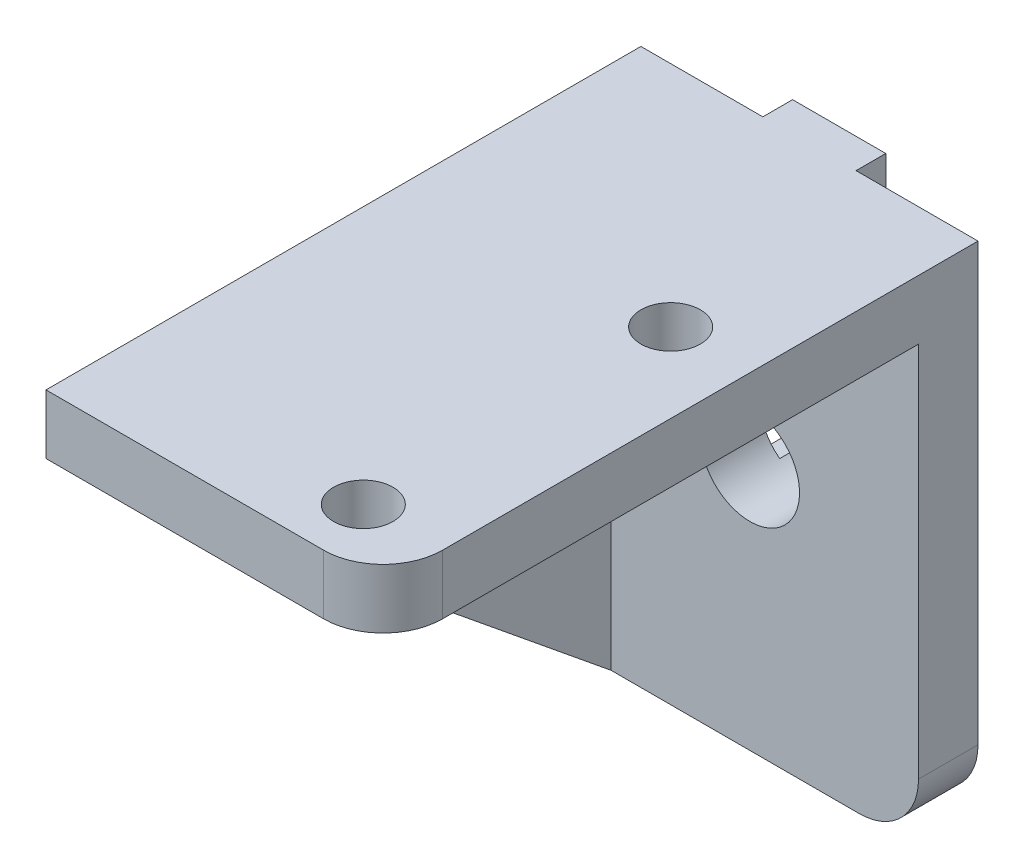
ISO-10303-21;
HEADER;
FILE_DESCRIPTION(('STEP AP214'),'2;1');
FILE_NAME('part.step','',(''),(''),'','','');
FILE_SCHEMA(('AUTOMOTIVE_DESIGN { 1 0 10303 214 1 1 1 1 }'));
ENDSEC;
DATA;
#1=APPLICATION_CONTEXT('core data for automotive mechanical design processes');
#2=APPLICATION_PROTOCOL_DEFINITION('international standard','automotive_design',2000,#1);
#3=PRODUCT_CONTEXT('',#1,'mechanical');
#4=PRODUCT('Part','Part','',(#3));
#5=PRODUCT_RELATED_PRODUCT_CATEGORY('part','',(#4));
#6=PRODUCT_DEFINITION_FORMATION('','',#4);
#7=PRODUCT_DEFINITION_CONTEXT('part definition',#1,'design');
#8=PRODUCT_DEFINITION('design','',#6,#7);
#9=PRODUCT_DEFINITION_SHAPE('','',#8);
#10=(LENGTH_UNIT() NAMED_UNIT(*) SI_UNIT(.MILLI.,.METRE.));
#11=(NAMED_UNIT(*) PLANE_ANGLE_UNIT() SI_UNIT($,.RADIAN.));
#12=(NAMED_UNIT(*) SI_UNIT($,.STERADIAN.) SOLID_ANGLE_UNIT());
#13=UNCERTAINTY_MEASURE_WITH_UNIT(LENGTH_MEASURE(1.E-05),#10,'distance_accuracy_value','');
#14=(GEOMETRIC_REPRESENTATION_CONTEXT(3) GLOBAL_UNCERTAINTY_ASSIGNED_CONTEXT((#13)) GLOBAL_UNIT_ASSIGNED_CONTEXT((#10,
#11,#12)) REPRESENTATION_CONTEXT('',''));
#15=CARTESIAN_POINT('',(0.,0.,0.));
#16=DIRECTION('',(0.,0.,1.));
#17=DIRECTION('',(1.,0.,0.));
#18=AXIS2_PLACEMENT_3D('',#15,#16,#17);
#19=CARTESIAN_POINT('',(-2.35,12.5,-1.5));
#20=DIRECTION('',(1.,0.,0.));
#21=DIRECTION('',(0.,0.,-1.));
#22=AXIS2_PLACEMENT_3D('',#19,#20,#21);
#23=PLANE('',#22);
#24=DIRECTION('',(0.,-1.,0.));
#25=VECTOR('',#24,1.);
#26=CARTESIAN_POINT('',(-2.35,12.5,-1.5));
#27=LINE('',#26,#25);
#28=CARTESIAN_POINT('',(-2.35,12.5,-1.5));
#29=VERTEX_POINT('',#28);
#30=CARTESIAN_POINT('',(-2.35,2.,-1.5));
#31=VERTEX_POINT('',#30);
#32=EDGE_CURVE('E334',#29,#31,#27,.T.);
#33=ORIENTED_EDGE('',*,*,#32,.T.);
#34=DIRECTION('',(0.,0.,-1.));
#35=VECTOR('',#34,1.);
#36=CARTESIAN_POINT('',(-2.35,2.,-1.5));
#37=LINE('',#36,#35);
#38=CARTESIAN_POINT('',(-2.35,2.,0.));
#39=VERTEX_POINT('',#38);
#40=EDGE_CURVE('E270',#39,#31,#37,.T.);
#41=ORIENTED_EDGE('',*,*,#40,.F.);
#42=DIRECTION('',(0.,-1.,0.));
#43=VECTOR('',#42,1.);
#44=CARTESIAN_POINT('',(-2.35,12.5,0.));
#45=LINE('',#44,#43);
#46=CARTESIAN_POINT('',(-2.35,12.5,0.));
#47=VERTEX_POINT('',#46);
#48=EDGE_CURVE('E211',#47,#39,#45,.T.);
#49=ORIENTED_EDGE('',*,*,#48,.F.);
#50=DIRECTION('',(0.,0.,1.));
#51=VECTOR('',#50,1.);
#52=CARTESIAN_POINT('',(-2.35,12.5,-1.5));
#53=LINE('',#52,#51);
#54=EDGE_CURVE('E303',#29,#47,#53,.T.);
#55=ORIENTED_EDGE('',*,*,#54,.F.);
#56=EDGE_LOOP('',(#33,#41,#49,#55));
#57=FACE_BOUND('',#56,.T.);
#58=ADVANCED_FACE('F34',(#57),#23,.F.);
#59=CARTESIAN_POINT('',(2.35,12.5,-1.5));
#60=DIRECTION('',(-1.,0.,0.));
#61=DIRECTION('',(0.,0.,1.));
#62=AXIS2_PLACEMENT_3D('',#59,#60,#61);
#63=PLANE('',#62);
#64=DIRECTION('',(0.,-1.,0.));
#65=VECTOR('',#64,1.);
#66=CARTESIAN_POINT('',(2.35,12.5,-1.5));
#67=LINE('',#66,#65);
#68=CARTESIAN_POINT('',(2.35,-2.,-1.5));
#69=VERTEX_POINT('',#68);
#70=CARTESIAN_POINT('',(2.35,-12.5,-1.5));
#71=VERTEX_POINT('',#70);
#72=EDGE_CURVE('E337',#69,#71,#67,.T.);
#73=ORIENTED_EDGE('',*,*,#72,.F.);
#74=DIRECTION('',(0.,0.,1.));
#75=VECTOR('',#74,1.);
#76=CARTESIAN_POINT('',(2.35,-2.,-1.5));
#77=LINE('',#76,#75);
#78=CARTESIAN_POINT('',(2.35,-2.,0.));
#79=VERTEX_POINT('',#78);
#80=EDGE_CURVE('E286',#69,#79,#77,.T.);
#81=ORIENTED_EDGE('',*,*,#80,.T.);
#82=DIRECTION('',(0.,-1.,0.));
#83=VECTOR('',#82,1.);
#84=CARTESIAN_POINT('',(2.35,12.5,0.));
#85=LINE('',#84,#83);
#86=CARTESIAN_POINT('',(2.35,-12.5,0.));
#87=VERTEX_POINT('',#86);
#88=EDGE_CURVE('E341',#79,#87,#85,.T.);
#89=ORIENTED_EDGE('',*,*,#88,.T.);
#90=DIRECTION('',(0.,0.,-1.));
#91=VECTOR('',#90,1.);
#92=CARTESIAN_POINT('',(2.35,-12.5,-1.5));
#93=LINE('',#92,#91);
#94=EDGE_CURVE('E329',#87,#71,#93,.T.);
#95=ORIENTED_EDGE('',*,*,#94,.T.);
#96=EDGE_LOOP('',(#73,#81,#89,#95));
#97=FACE_BOUND('',#96,.T.);
#98=ADVANCED_FACE('F365',(#97),#63,.F.);
#99=CARTESIAN_POINT('',(-2.35,12.5,-1.5));
#100=DIRECTION('',(0.,0.,1.));
#101=DIRECTION('',(1.,0.,0.));
#102=AXIS2_PLACEMENT_3D('',#99,#100,#101);
#103=PLANE('',#102);
#104=CARTESIAN_POINT('',(2.35,12.5,-1.5));
#105=VERTEX_POINT('',#104);
#106=CARTESIAN_POINT('',(2.35,2.,-1.5));
#107=VERTEX_POINT('',#106);
#108=EDGE_CURVE('E338',#105,#107,#67,.T.);
#109=ORIENTED_EDGE('',*,*,#108,.T.);
#110=DIRECTION('',(-1.,0.,0.));
#111=VECTOR('',#110,1.);
#112=CARTESIAN_POINT('',(8.5,2.,-1.5));
#113=LINE('',#112,#111);
#114=CARTESIAN_POINT('',(1.5,2.,-1.5));
#115=VERTEX_POINT('',#114);
#116=EDGE_CURVE('E276',#107,#115,#113,.T.);
#117=ORIENTED_EDGE('',*,*,#116,.T.);
#118=CARTESIAN_POINT('',(0.,0.,-1.5));
#119=DIRECTION('',(0.,0.,1.));
#120=DIRECTION('',(1.,0.,0.));
#121=AXIS2_PLACEMENT_3D('',#118,#119,#120);
#122=CIRCLE('',#121,2.5);
#123=CARTESIAN_POINT('',(-1.5,2.,-1.5));
#124=VERTEX_POINT('',#123);
#125=EDGE_CURVE('E292',#115,#124,#122,.T.);
#126=ORIENTED_EDGE('',*,*,#125,.T.);
#127=EDGE_CURVE('E273',#124,#31,#113,.T.);
#128=ORIENTED_EDGE('',*,*,#127,.T.);
#129=ORIENTED_EDGE('',*,*,#32,.F.);
#130=DIRECTION('',(-1.,0.,0.));
#131=VECTOR('',#130,1.);
#132=CARTESIAN_POINT('',(-2.35,12.5,-1.5));
#133=LINE('',#132,#131);
#134=EDGE_CURVE('E315',#105,#29,#133,.T.);
#135=ORIENTED_EDGE('',*,*,#134,.F.);
#136=EDGE_LOOP('',(#109,#117,#126,#128,#129,#135));
#137=FACE_BOUND('',#136,.T.);
#138=ADVANCED_FACE('F429',(#137),#103,.F.);
#139=CARTESIAN_POINT('',(-2.35,-2.,0.));
#140=VERTEX_POINT('',#139);
#141=CARTESIAN_POINT('',(-2.35,-12.5,0.));
#142=VERTEX_POINT('',#141);
#143=EDGE_CURVE('E204',#140,#142,#45,.T.);
#144=ORIENTED_EDGE('',*,*,#143,.F.);
#145=DIRECTION('',(0.,0.,1.));
#146=VECTOR('',#145,1.);
#147=CARTESIAN_POINT('',(-2.35,-2.,-1.5));
#148=LINE('',#147,#146);
#149=CARTESIAN_POINT('',(-2.35,-2.,-1.5));
#150=VERTEX_POINT('',#149);
#151=EDGE_CURVE('E267',#150,#140,#148,.T.);
#152=ORIENTED_EDGE('',*,*,#151,.F.);
#153=CARTESIAN_POINT('',(-2.35,-12.5,-1.5));
#154=VERTEX_POINT('',#153);
#155=EDGE_CURVE('E317',#150,#154,#27,.T.);
#156=ORIENTED_EDGE('',*,*,#155,.T.);
#157=DIRECTION('',(0.,0.,1.));
#158=VECTOR('',#157,1.);
#159=CARTESIAN_POINT('',(-2.35,-12.5,-1.5));
#160=LINE('',#159,#158);
#161=EDGE_CURVE('E302',#154,#142,#160,.T.);
#162=ORIENTED_EDGE('',*,*,#161,.T.);
#163=EDGE_LOOP('',(#144,#152,#156,#162));
#164=FACE_BOUND('',#163,.T.);
#165=ADVANCED_FACE('F386',(#164),#23,.F.);
#166=CARTESIAN_POINT('',(-8.5,12.5,0.));
#167=DIRECTION('',(0.,0.,1.));
#168=DIRECTION('',(1.,0.,0.));
#169=AXIS2_PLACEMENT_3D('',#166,#167,#168);
#170=PLANE('',#169);
#171=DIRECTION('',(-1.,0.,0.));
#172=VECTOR('',#171,1.);
#173=CARTESIAN_POINT('',(-8.5,-12.5,0.));
#174=LINE('',#173,#172);
#175=CARTESIAN_POINT('',(-8.5,-12.5,0.));
#176=VERTEX_POINT('',#175);
#177=EDGE_CURVE('E320',#142,#176,#174,.T.);
#178=ORIENTED_EDGE('',*,*,#177,.T.);
#179=DIRECTION('',(0.,-1.,0.));
#180=VECTOR('',#179,1.);
#181=CARTESIAN_POINT('',(-8.5,12.5,0.));
#182=LINE('',#181,#180);
#183=CARTESIAN_POINT('',(-8.5,12.5,0.));
#184=VERTEX_POINT('',#183);
#185=EDGE_CURVE('E201',#184,#176,#182,.T.);
#186=ORIENTED_EDGE('',*,*,#185,.F.);
#187=DIRECTION('',(-1.,0.,0.));
#188=VECTOR('',#187,1.);
#189=CARTESIAN_POINT('',(-8.5,12.5,0.));
#190=LINE('',#189,#188);
#191=EDGE_CURVE('E306',#47,#184,#190,.T.);
#192=ORIENTED_EDGE('',*,*,#191,.F.);
#193=ORIENTED_EDGE('',*,*,#48,.T.);
#194=DIRECTION('',(-1.,0.,0.));
#195=VECTOR('',#194,1.);
#196=CARTESIAN_POINT('',(8.5,2.,0.));
#197=LINE('',#196,#195);
#198=CARTESIAN_POINT('',(-1.5,2.,0.));
#199=VERTEX_POINT('',#198);
#200=EDGE_CURVE('E278',#199,#39,#197,.T.);
#201=ORIENTED_EDGE('',*,*,#200,.F.);
#202=CARTESIAN_POINT('',(0.,0.,0.));
#203=DIRECTION('',(0.,0.,1.));
#204=DIRECTION('',(1.,0.,0.));
#205=AXIS2_PLACEMENT_3D('',#202,#203,#204);
#206=CIRCLE('',#205,2.5);
#207=CARTESIAN_POINT('',(-1.5,-2.,0.));
#208=VERTEX_POINT('',#207);
#209=EDGE_CURVE('E300',#199,#208,#206,.T.);
#210=ORIENTED_EDGE('',*,*,#209,.T.);
#211=DIRECTION('',(-1.,0.,0.));
#212=VECTOR('',#211,1.);
#213=CARTESIAN_POINT('',(8.5,-2.,0.));
#214=LINE('',#213,#212);
#215=EDGE_CURVE('E282',#208,#140,#214,.T.);
#216=ORIENTED_EDGE('',*,*,#215,.T.);
#217=ORIENTED_EDGE('',*,*,#143,.T.);
#218=EDGE_LOOP('',(#178,#186,#192,#193,#201,#210,#216,#217));
#219=FACE_BOUND('',#218,.T.);
#220=ADVANCED_FACE('F389',(#219),#170,.F.);
#221=CARTESIAN_POINT('',(-8.5,12.5,0.));
#222=DIRECTION('',(1.,0.,0.));
#223=DIRECTION('',(0.,0.,-1.));
#224=AXIS2_PLACEMENT_3D('',#221,#222,#223);
#225=PLANE('',#224);
#226=DIRECTION('',(0.,0.,1.));
#227=VECTOR('',#226,1.);
#228=CARTESIAN_POINT('',(-8.5,-12.5,0.));
#229=LINE('',#228,#227);
#230=CARTESIAN_POINT('',(-8.5,-12.5,3.));
#231=VERTEX_POINT('',#230);
#232=EDGE_CURVE('E196',#176,#231,#229,.T.);
#233=ORIENTED_EDGE('',*,*,#232,.T.);
#234=DIRECTION('',(0.,0.631672951162236,0.775234985517289));
#235=VECTOR('',#234,1.);
#236=CARTESIAN_POINT('',(-8.5,9.5,30.));
#237=LINE('',#236,#235);
#238=CARTESIAN_POINT('',(-8.5,9.5,30.));
#239=VERTEX_POINT('',#238);
#240=EDGE_CURVE('E179',#231,#239,#237,.T.);
#241=ORIENTED_EDGE('',*,*,#240,.T.);
#242=DIRECTION('',(0.,-1.,0.));
#243=VECTOR('',#242,1.);
#244=CARTESIAN_POINT('',(-8.5,12.5,30.));
#245=LINE('',#244,#243);
#246=CARTESIAN_POINT('',(-8.5,12.5,30.));
#247=VERTEX_POINT('',#246);
#248=EDGE_CURVE('E193',#247,#239,#245,.T.);
#249=ORIENTED_EDGE('',*,*,#248,.F.);
#250=DIRECTION('',(0.,0.,1.));
#251=VECTOR('',#250,1.);
#252=CARTESIAN_POINT('',(-8.5,12.5,0.));
#253=LINE('',#252,#251);
#254=EDGE_CURVE('E309',#184,#247,#253,.T.);
#255=ORIENTED_EDGE('',*,*,#254,.F.);
#256=ORIENTED_EDGE('',*,*,#185,.T.);
#257=EDGE_LOOP('',(#233,#241,#249,#255,#256));
#258=FACE_BOUND('',#257,.T.);
#259=ADVANCED_FACE('F191',(#258),#225,.F.);
#260=CARTESIAN_POINT('',(-7.,12.5,30.));
#261=DIRECTION('',(0.,0.,-1.));
#262=DIRECTION('',(-1.,0.,0.));
#263=AXIS2_PLACEMENT_3D('',#260,#261,#262);
#264=PLANE('',#263);
#265=DIRECTION('',(1.,0.,0.));
#266=VECTOR('',#265,1.);
#267=CARTESIAN_POINT('',(8.5,9.5,30.));
#268=LINE('',#267,#266);
#269=CARTESIAN_POINT('',(-6.99999999999999,9.5,30.));
#270=VERTEX_POINT('',#269);
#271=CARTESIAN_POINT('',(5.5,9.5,30.));
#272=VERTEX_POINT('',#271);
#273=EDGE_CURVE('E254',#270,#272,#268,.T.);
#274=ORIENTED_EDGE('',*,*,#273,.T.);
#275=DIRECTION('',(0.,1.,0.));
#276=VECTOR('',#275,1.);
#277=CARTESIAN_POINT('',(5.5,12.5,30.));
#278=LINE('',#277,#276);
#279=CARTESIAN_POINT('',(5.5,12.5,30.));
#280=VERTEX_POINT('',#279);
#281=EDGE_CURVE('E239',#272,#280,#278,.T.);
#282=ORIENTED_EDGE('',*,*,#281,.T.);
#283=DIRECTION('',(1.,0.,0.));
#284=VECTOR('',#283,1.);
#285=CARTESIAN_POINT('',(-7.,12.5,30.));
#286=LINE('',#285,#284);
#287=EDGE_CURVE('E200',#247,#280,#286,.T.);
#288=ORIENTED_EDGE('',*,*,#287,.F.);
#289=ORIENTED_EDGE('',*,*,#248,.T.);
#290=DIRECTION('',(1.,0.,0.));
#291=VECTOR('',#290,1.);
#292=CARTESIAN_POINT('',(-8.5,9.5,30.));
#293=LINE('',#292,#291);
#294=EDGE_CURVE('E176',#239,#270,#293,.T.);
#295=ORIENTED_EDGE('',*,*,#294,.T.);
#296=EDGE_LOOP('',(#274,#282,#288,#289,#295));
#297=FACE_BOUND('',#296,.T.);
#298=ADVANCED_FACE('F198',(#297),#264,.F.);
#299=CARTESIAN_POINT('',(-7.,12.5,3.));
#300=DIRECTION('',(-1.,0.,0.));
#301=DIRECTION('',(0.,0.,1.));
#302=AXIS2_PLACEMENT_3D('',#299,#300,#301);
#303=PLANE('',#302);
#304=DIRECTION('',(0.,0.,1.));
#305=VECTOR('',#304,1.);
#306=CARTESIAN_POINT('',(-7.,9.5,3.));
#307=LINE('',#306,#305);
#308=CARTESIAN_POINT('',(-7.,9.5,3.));
#309=VERTEX_POINT('',#308);
#310=EDGE_CURVE('E260',#309,#270,#307,.T.);
#311=ORIENTED_EDGE('',*,*,#310,.T.);
#312=DIRECTION('',(0.,0.631672951162236,0.775234985517289));
#313=VECTOR('',#312,1.);
#314=CARTESIAN_POINT('',(-6.99999999999999,9.5,30.));
#315=LINE('',#314,#313);
#316=CARTESIAN_POINT('',(-7.,-12.5,3.));
#317=VERTEX_POINT('',#316);
#318=EDGE_CURVE('E182',#317,#270,#315,.T.);
#319=ORIENTED_EDGE('',*,*,#318,.F.);
#320=DIRECTION('',(0.,-1.,0.));
#321=VECTOR('',#320,1.);
#322=CARTESIAN_POINT('',(-7.,12.5,3.));
#323=LINE('',#322,#321);
#324=EDGE_CURVE('E202',#309,#317,#323,.T.);
#325=ORIENTED_EDGE('',*,*,#324,.F.);
#326=EDGE_LOOP('',(#311,#319,#325));
#327=FACE_BOUND('',#326,.T.);
#328=ADVANCED_FACE('F458',(#327),#303,.F.);
#329=CARTESIAN_POINT('',(8.5,12.5,3.));
#330=DIRECTION('',(0.,0.,-1.));
#331=DIRECTION('',(-1.,0.,0.));
#332=AXIS2_PLACEMENT_3D('',#329,#330,#331);
#333=PLANE('',#332);
#334=CARTESIAN_POINT('',(0.,0.,3.));
#335=DIRECTION('',(0.,0.,-1.));
#336=DIRECTION('',(-1.,0.,0.));
#337=AXIS2_PLACEMENT_3D('',#334,#335,#336);
#338=CIRCLE('',#337,2.5);
#339=CARTESIAN_POINT('',(-2.5,0.,3.));
#340=VERTEX_POINT('',#339);
#341=EDGE_CURVE('E297',#340,#340,#338,.T.);
#342=ORIENTED_EDGE('',*,*,#341,.T.);
#343=EDGE_LOOP('',(#342));
#344=FACE_BOUND('',#343,.T.);
#345=DIRECTION('',(1.,0.,0.));
#346=VECTOR('',#345,1.);
#347=CARTESIAN_POINT('',(8.5,-12.5,3.));
#348=LINE('',#347,#346);
#349=CARTESIAN_POINT('',(5.5,-12.5,3.));
#350=VERTEX_POINT('',#349);
#351=EDGE_CURVE('E324',#317,#350,#348,.T.);
#352=ORIENTED_EDGE('',*,*,#351,.T.);
#353=CARTESIAN_POINT('',(5.5,-9.5,3.));
#354=DIRECTION('',(0.,0.,-1.));
#355=DIRECTION('',(-1.,0.,0.));
#356=AXIS2_PLACEMENT_3D('',#353,#354,#355);
#357=CIRCLE('',#356,3.);
#358=CARTESIAN_POINT('',(8.5,-9.5,3.));
#359=VERTEX_POINT('',#358);
#360=EDGE_CURVE('E237',#350,#359,#357,.F.);
#361=ORIENTED_EDGE('',*,*,#360,.T.);
#362=DIRECTION('',(0.,-1.,0.));
#363=VECTOR('',#362,1.);
#364=CARTESIAN_POINT('',(8.5,12.5,3.));
#365=LINE('',#364,#363);
#366=CARTESIAN_POINT('',(8.5,9.5,3.));
#367=VERTEX_POINT('',#366);
#368=EDGE_CURVE('E207',#367,#359,#365,.T.);
#369=ORIENTED_EDGE('',*,*,#368,.F.);
#370=DIRECTION('',(-1.,0.,0.));
#371=VECTOR('',#370,1.);
#372=CARTESIAN_POINT('',(8.5,9.5,3.));
#373=LINE('',#372,#371);
#374=EDGE_CURVE('E256',#367,#309,#373,.T.);
#375=ORIENTED_EDGE('',*,*,#374,.T.);
#376=ORIENTED_EDGE('',*,*,#324,.T.);
#377=EDGE_LOOP('',(#352,#361,#369,#375,#376));
#378=FACE_BOUND('',#377,.T.);
#379=ADVANCED_FACE('F455',(#344,#378),#333,.F.);
#380=CARTESIAN_POINT('',(8.5,12.5,3.));
#381=DIRECTION('',(-1.,0.,0.));
#382=DIRECTION('',(0.,0.,1.));
#383=AXIS2_PLACEMENT_3D('',#380,#381,#382);
#384=PLANE('',#383);
#385=ORIENTED_EDGE('',*,*,#368,.T.);
#386=DIRECTION('',(0.,0.,-1.));
#387=VECTOR('',#386,1.);
#388=CARTESIAN_POINT('',(8.5,-9.5,3.));
#389=LINE('',#388,#387);
#390=CARTESIAN_POINT('',(8.5,-9.5,0.));
#391=VERTEX_POINT('',#390);
#392=EDGE_CURVE('E230',#359,#391,#389,.T.);
#393=ORIENTED_EDGE('',*,*,#392,.T.);
#394=DIRECTION('',(0.,-1.,0.));
#395=VECTOR('',#394,1.);
#396=CARTESIAN_POINT('',(8.5,12.5,0.));
#397=LINE('',#396,#395);
#398=CARTESIAN_POINT('',(8.5,12.5,0.));
#399=VERTEX_POINT('',#398);
#400=EDGE_CURVE('E250',#399,#391,#397,.T.);
#401=ORIENTED_EDGE('',*,*,#400,.F.);
#402=DIRECTION('',(0.,0.,-1.));
#403=VECTOR('',#402,1.);
#404=CARTESIAN_POINT('',(8.5,12.5,3.));
#405=LINE('',#404,#403);
#406=CARTESIAN_POINT('',(8.5,12.5,27.));
#407=VERTEX_POINT('',#406);
#408=EDGE_CURVE('E244',#407,#399,#405,.T.);
#409=ORIENTED_EDGE('',*,*,#408,.F.);
#410=DIRECTION('',(0.,1.,0.));
#411=VECTOR('',#410,1.);
#412=CARTESIAN_POINT('',(8.5,12.5,27.));
#413=LINE('',#412,#411);
#414=CARTESIAN_POINT('',(8.5,9.5,27.));
#415=VERTEX_POINT('',#414);
#416=EDGE_CURVE('E228',#407,#415,#413,.F.);
#417=ORIENTED_EDGE('',*,*,#416,.T.);
#418=DIRECTION('',(0.,0.,-1.));
#419=VECTOR('',#418,1.);
#420=CARTESIAN_POINT('',(8.5,9.5,0.));
#421=LINE('',#420,#419);
#422=EDGE_CURVE('E257',#415,#367,#421,.T.);
#423=ORIENTED_EDGE('',*,*,#422,.T.);
#424=EDGE_LOOP('',(#385,#393,#401,#409,#417,#423));
#425=FACE_BOUND('',#424,.T.);
#426=ADVANCED_FACE('F248',(#425),#384,.F.);
#427=CARTESIAN_POINT('',(2.35,12.5,0.));
#428=DIRECTION('',(0.,0.,1.));
#429=DIRECTION('',(1.,0.,0.));
#430=AXIS2_PLACEMENT_3D('',#427,#428,#429);
#431=PLANE('',#430);
#432=ORIENTED_EDGE('',*,*,#400,.T.);
#433=CARTESIAN_POINT('',(5.5,-9.5,0.));
#434=DIRECTION('',(0.,0.,1.));
#435=DIRECTION('',(1.,0.,0.));
#436=AXIS2_PLACEMENT_3D('',#433,#434,#435);
#437=CIRCLE('',#436,3.);
#438=CARTESIAN_POINT('',(5.5,-12.5,0.));
#439=VERTEX_POINT('',#438);
#440=EDGE_CURVE('E233',#391,#439,#437,.F.);
#441=ORIENTED_EDGE('',*,*,#440,.T.);
#442=DIRECTION('',(-1.,0.,0.));
#443=VECTOR('',#442,1.);
#444=CARTESIAN_POINT('',(2.35,-12.5,0.));
#445=LINE('',#444,#443);
#446=EDGE_CURVE('E327',#439,#87,#445,.T.);
#447=ORIENTED_EDGE('',*,*,#446,.T.);
#448=ORIENTED_EDGE('',*,*,#88,.F.);
#449=CARTESIAN_POINT('',(1.5,-2.,0.));
#450=VERTEX_POINT('',#449);
#451=EDGE_CURVE('E281',#79,#450,#214,.T.);
#452=ORIENTED_EDGE('',*,*,#451,.T.);
#453=CARTESIAN_POINT('',(0.,0.,0.));
#454=DIRECTION('',(0.,0.,1.));
#455=DIRECTION('',(1.,0.,0.));
#456=AXIS2_PLACEMENT_3D('',#453,#454,#455);
#457=CIRCLE('',#456,2.5);
#458=CARTESIAN_POINT('',(1.5,2.,0.));
#459=VERTEX_POINT('',#458);
#460=EDGE_CURVE('E295',#450,#459,#457,.T.);
#461=ORIENTED_EDGE('',*,*,#460,.T.);
#462=CARTESIAN_POINT('',(2.35,2.,0.));
#463=VERTEX_POINT('',#462);
#464=EDGE_CURVE('E277',#463,#459,#197,.T.);
#465=ORIENTED_EDGE('',*,*,#464,.F.);
#466=CARTESIAN_POINT('',(2.35,12.5,0.));
#467=VERTEX_POINT('',#466);
#468=EDGE_CURVE('E342',#467,#463,#85,.T.);
#469=ORIENTED_EDGE('',*,*,#468,.F.);
#470=DIRECTION('',(-1.,0.,0.));
#471=VECTOR('',#470,1.);
#472=CARTESIAN_POINT('',(2.35,12.5,0.));
#473=LINE('',#472,#471);
#474=EDGE_CURVE('E252',#399,#467,#473,.T.);
#475=ORIENTED_EDGE('',*,*,#474,.F.);
#476=EDGE_LOOP('',(#432,#441,#447,#448,#452,#461,#465,#469,#475));
#477=FACE_BOUND('',#476,.T.);
#478=ADVANCED_FACE('F354',(#477),#431,.F.);
#479=ORIENTED_EDGE('',*,*,#468,.T.);
#480=DIRECTION('',(0.,0.,-1.));
#481=VECTOR('',#480,1.);
#482=CARTESIAN_POINT('',(2.35,2.,-1.5));
#483=LINE('',#482,#481);
#484=EDGE_CURVE('E289',#463,#107,#483,.T.);
#485=ORIENTED_EDGE('',*,*,#484,.T.);
#486=ORIENTED_EDGE('',*,*,#108,.F.);
#487=DIRECTION('',(0.,0.,-1.));
#488=VECTOR('',#487,1.);
#489=CARTESIAN_POINT('',(2.35,12.5,-1.5));
#490=LINE('',#489,#488);
#491=EDGE_CURVE('E313',#467,#105,#490,.T.);
#492=ORIENTED_EDGE('',*,*,#491,.F.);
#493=EDGE_LOOP('',(#479,#485,#486,#492));
#494=FACE_BOUND('',#493,.T.);
#495=ADVANCED_FACE('F431',(#494),#63,.F.);
#496=ORIENTED_EDGE('',*,*,#155,.F.);
#497=DIRECTION('',(-1.,0.,0.));
#498=VECTOR('',#497,1.);
#499=CARTESIAN_POINT('',(8.5,-2.,-1.5));
#500=LINE('',#499,#498);
#501=CARTESIAN_POINT('',(-1.5,-2.,-1.5));
#502=VERTEX_POINT('',#501);
#503=EDGE_CURVE('E272',#502,#150,#500,.T.);
#504=ORIENTED_EDGE('',*,*,#503,.F.);
#505=CARTESIAN_POINT('',(0.,0.,-1.5));
#506=DIRECTION('',(0.,0.,1.));
#507=DIRECTION('',(1.,0.,0.));
#508=AXIS2_PLACEMENT_3D('',#505,#506,#507);
#509=CIRCLE('',#508,2.5);
#510=CARTESIAN_POINT('',(1.5,-2.,-1.5));
#511=VERTEX_POINT('',#510);
#512=EDGE_CURVE('E213',#502,#511,#509,.T.);
#513=ORIENTED_EDGE('',*,*,#512,.T.);
#514=EDGE_CURVE('E284',#69,#511,#500,.T.);
#515=ORIENTED_EDGE('',*,*,#514,.F.);
#516=ORIENTED_EDGE('',*,*,#72,.T.);
#517=DIRECTION('',(-1.,0.,0.));
#518=VECTOR('',#517,1.);
#519=CARTESIAN_POINT('',(-2.35,-12.5,-1.5));
#520=LINE('',#519,#518);
#521=EDGE_CURVE('E307',#71,#154,#520,.T.);
#522=ORIENTED_EDGE('',*,*,#521,.T.);
#523=EDGE_LOOP('',(#496,#504,#513,#515,#516,#522));
#524=FACE_BOUND('',#523,.T.);
#525=ADVANCED_FACE('F379',(#524),#103,.F.);
#526=CARTESIAN_POINT('',(0.,12.5,0.));
#527=DIRECTION('',(0.,1.,0.));
#528=DIRECTION('',(0.,0.,1.));
#529=AXIS2_PLACEMENT_3D('',#526,#527,#528);
#530=PLANE('',#529);
#531=ORIENTED_EDGE('',*,*,#287,.T.);
#532=CARTESIAN_POINT('',(5.5,12.5,27.));
#533=DIRECTION('',(0.,1.,0.));
#534=DIRECTION('',(0.,0.,1.));
#535=AXIS2_PLACEMENT_3D('',#532,#533,#534);
#536=CIRCLE('',#535,3.);
#537=EDGE_CURVE('E42',#280,#407,#536,.T.);
#538=ORIENTED_EDGE('',*,*,#537,.T.);
#539=ORIENTED_EDGE('',*,*,#408,.T.);
#540=ORIENTED_EDGE('',*,*,#474,.T.);
#541=ORIENTED_EDGE('',*,*,#491,.T.);
#542=ORIENTED_EDGE('',*,*,#134,.T.);
#543=ORIENTED_EDGE('',*,*,#54,.T.);
#544=ORIENTED_EDGE('',*,*,#191,.T.);
#545=ORIENTED_EDGE('',*,*,#254,.T.);
#546=EDGE_LOOP('',(#531,#538,#539,#540,#541,#542,#543,#544,#545));
#547=FACE_BOUND('',#546,.T.);
#548=CARTESIAN_POINT('',(4.5,12.5,27.));
#549=DIRECTION('',(0.,1.,0.));
#550=DIRECTION('',(0.,0.,1.));
#551=AXIS2_PLACEMENT_3D('',#548,#549,#550);
#552=CIRCLE('',#551,1.5);
#553=CARTESIAN_POINT('',(4.5,12.5,28.5));
#554=VERTEX_POINT('',#553);
#555=EDGE_CURVE('E397',#554,#554,#552,.T.);
#556=ORIENTED_EDGE('',*,*,#555,.F.);
#557=EDGE_LOOP('',(#556));
#558=FACE_BOUND('',#557,.T.);
#559=CARTESIAN_POINT('',(4.5,12.5,11.5));
#560=DIRECTION('',(0.,1.,0.));
#561=DIRECTION('',(0.,0.,1.));
#562=AXIS2_PLACEMENT_3D('',#559,#560,#561);
#563=CIRCLE('',#562,1.5);
#564=CARTESIAN_POINT('',(4.5,12.5,13.));
#565=VERTEX_POINT('',#564);
#566=EDGE_CURVE('E185',#565,#565,#563,.T.);
#567=ORIENTED_EDGE('',*,*,#566,.F.);
#568=EDGE_LOOP('',(#567));
#569=FACE_BOUND('',#568,.T.);
#570=ADVANCED_FACE('F242',(#547,#558,#569),#530,.T.);
#571=CARTESIAN_POINT('',(0.,-12.5,0.));
#572=DIRECTION('',(0.,1.,0.));
#573=DIRECTION('',(0.,0.,1.));
#574=AXIS2_PLACEMENT_3D('',#571,#572,#573);
#575=PLANE('',#574);
#576=ORIENTED_EDGE('',*,*,#446,.F.);
#577=DIRECTION('',(0.,0.,-1.));
#578=VECTOR('',#577,1.);
#579=CARTESIAN_POINT('',(5.5,-12.5,0.));
#580=LINE('',#579,#578);
#581=EDGE_CURVE('E235',#439,#350,#580,.F.);
#582=ORIENTED_EDGE('',*,*,#581,.T.);
#583=ORIENTED_EDGE('',*,*,#351,.F.);
#584=DIRECTION('',(1.,0.,0.));
#585=VECTOR('',#584,1.);
#586=CARTESIAN_POINT('',(-8.5,-12.5,3.));
#587=LINE('',#586,#585);
#588=EDGE_CURVE('E186',#231,#317,#587,.T.);
#589=ORIENTED_EDGE('',*,*,#588,.F.);
#590=ORIENTED_EDGE('',*,*,#232,.F.);
#591=ORIENTED_EDGE('',*,*,#177,.F.);
#592=ORIENTED_EDGE('',*,*,#161,.F.);
#593=ORIENTED_EDGE('',*,*,#521,.F.);
#594=ORIENTED_EDGE('',*,*,#94,.F.);
#595=EDGE_LOOP('',(#576,#582,#583,#589,#590,#591,#592,#593,#594));
#596=FACE_BOUND('',#595,.T.);
#597=ADVANCED_FACE('F359',(#596),#575,.F.);
#598=CARTESIAN_POINT('',(0.,0.,-1.5));
#599=DIRECTION('',(0.,0.,1.));
#600=DIRECTION('',(1.,0.,0.));
#601=AXIS2_PLACEMENT_3D('',#598,#599,#600);
#602=CYLINDRICAL_SURFACE('',#601,2.5);
#603=ORIENTED_EDGE('',*,*,#341,.F.);
#604=EDGE_LOOP('',(#603));
#605=FACE_BOUND('',#604,.T.);
#606=ORIENTED_EDGE('',*,*,#209,.F.);
#607=DIRECTION('',(0.,0.,1.));
#608=VECTOR('',#607,1.);
#609=CARTESIAN_POINT('',(-1.5,2.,-1.5));
#610=LINE('',#609,#608);
#611=EDGE_CURVE('E225',#199,#124,#610,.F.);
#612=ORIENTED_EDGE('',*,*,#611,.T.);
#613=ORIENTED_EDGE('',*,*,#125,.F.);
#614=DIRECTION('',(0.,0.,1.));
#615=VECTOR('',#614,1.);
#616=CARTESIAN_POINT('',(1.5,2.,-1.5));
#617=LINE('',#616,#615);
#618=EDGE_CURVE('E222',#115,#459,#617,.T.);
#619=ORIENTED_EDGE('',*,*,#618,.T.);
#620=ORIENTED_EDGE('',*,*,#460,.F.);
#621=DIRECTION('',(0.,0.,1.));
#622=VECTOR('',#621,1.);
#623=CARTESIAN_POINT('',(1.5,-2.,-1.5));
#624=LINE('',#623,#622);
#625=EDGE_CURVE('E219',#450,#511,#624,.F.);
#626=ORIENTED_EDGE('',*,*,#625,.T.);
#627=ORIENTED_EDGE('',*,*,#512,.F.);
#628=DIRECTION('',(0.,0.,1.));
#629=VECTOR('',#628,1.);
#630=CARTESIAN_POINT('',(-1.5,-2.,-1.5));
#631=LINE('',#630,#629);
#632=EDGE_CURVE('E216',#502,#208,#631,.T.);
#633=ORIENTED_EDGE('',*,*,#632,.T.);
#634=EDGE_LOOP('',(#606,#612,#613,#619,#620,#626,#627,#633));
#635=FACE_BOUND('',#634,.T.);
#636=ADVANCED_FACE('F375',(#605,#635),#602,.F.);
#637=CARTESIAN_POINT('',(8.5,-2.,-1.5));
#638=DIRECTION('',(0.,-1.,0.));
#639=DIRECTION('',(0.,0.,-1.));
#640=AXIS2_PLACEMENT_3D('',#637,#638,#639);
#641=PLANE('',#640);
#642=ORIENTED_EDGE('',*,*,#503,.T.);
#643=ORIENTED_EDGE('',*,*,#151,.T.);
#644=ORIENTED_EDGE('',*,*,#215,.F.);
#645=ORIENTED_EDGE('',*,*,#632,.F.);
#646=EDGE_LOOP('',(#642,#643,#644,#645));
#647=FACE_BOUND('',#646,.T.);
#648=ADVANCED_FACE('F382',(#647),#641,.F.);
#649=ORIENTED_EDGE('',*,*,#514,.T.);
#650=ORIENTED_EDGE('',*,*,#625,.F.);
#651=ORIENTED_EDGE('',*,*,#451,.F.);
#652=ORIENTED_EDGE('',*,*,#80,.F.);
#653=EDGE_LOOP('',(#649,#650,#651,#652));
#654=FACE_BOUND('',#653,.T.);
#655=ADVANCED_FACE('F371',(#654),#641,.F.);
#656=CARTESIAN_POINT('',(8.5,2.,-1.5));
#657=DIRECTION('',(0.,1.,0.));
#658=DIRECTION('',(0.,0.,1.));
#659=AXIS2_PLACEMENT_3D('',#656,#657,#658);
#660=PLANE('',#659);
#661=ORIENTED_EDGE('',*,*,#464,.T.);
#662=ORIENTED_EDGE('',*,*,#618,.F.);
#663=ORIENTED_EDGE('',*,*,#116,.F.);
#664=ORIENTED_EDGE('',*,*,#484,.F.);
#665=EDGE_LOOP('',(#661,#662,#663,#664));
#666=FACE_BOUND('',#665,.T.);
#667=ADVANCED_FACE('F573',(#666),#660,.F.);
#668=ORIENTED_EDGE('',*,*,#200,.T.);
#669=ORIENTED_EDGE('',*,*,#40,.T.);
#670=ORIENTED_EDGE('',*,*,#127,.F.);
#671=ORIENTED_EDGE('',*,*,#611,.F.);
#672=EDGE_LOOP('',(#668,#669,#670,#671));
#673=FACE_BOUND('',#672,.T.);
#674=ADVANCED_FACE('F519',(#673),#660,.F.);
#675=CARTESIAN_POINT('',(0.,9.5,0.));
#676=DIRECTION('',(0.,-1.,0.));
#677=DIRECTION('',(0.,0.,-1.));
#678=AXIS2_PLACEMENT_3D('',#675,#676,#677);
#679=PLANE('',#678);
#680=CARTESIAN_POINT('',(4.5,9.5,27.));
#681=DIRECTION('',(0.,1.,0.));
#682=DIRECTION('',(0.,0.,1.));
#683=AXIS2_PLACEMENT_3D('',#680,#681,#682);
#684=CIRCLE('',#683,1.5);
#685=CARTESIAN_POINT('',(4.5,9.5,28.5));
#686=VERTEX_POINT('',#685);
#687=EDGE_CURVE('E262',#686,#686,#684,.T.);
#688=ORIENTED_EDGE('',*,*,#687,.T.);
#689=EDGE_LOOP('',(#688));
#690=FACE_BOUND('',#689,.T.);
#691=CARTESIAN_POINT('',(4.5,9.5,11.5));
#692=DIRECTION('',(0.,1.,0.));
#693=DIRECTION('',(0.,0.,1.));
#694=AXIS2_PLACEMENT_3D('',#691,#692,#693);
#695=CIRCLE('',#694,1.5);
#696=CARTESIAN_POINT('',(4.5,9.5,13.));
#697=VERTEX_POINT('',#696);
#698=EDGE_CURVE('E394',#697,#697,#695,.T.);
#699=ORIENTED_EDGE('',*,*,#698,.T.);
#700=EDGE_LOOP('',(#699));
#701=FACE_BOUND('',#700,.T.);
#702=ORIENTED_EDGE('',*,*,#422,.F.);
#703=CARTESIAN_POINT('',(5.5,9.5,27.));
#704=DIRECTION('',(0.,-1.,0.));
#705=DIRECTION('',(0.,0.,-1.));
#706=AXIS2_PLACEMENT_3D('',#703,#704,#705);
#707=CIRCLE('',#706,3.);
#708=EDGE_CURVE('E11',#415,#272,#707,.T.);
#709=ORIENTED_EDGE('',*,*,#708,.T.);
#710=ORIENTED_EDGE('',*,*,#273,.F.);
#711=ORIENTED_EDGE('',*,*,#310,.F.);
#712=ORIENTED_EDGE('',*,*,#374,.F.);
#713=EDGE_LOOP('',(#702,#709,#710,#711,#712));
#714=FACE_BOUND('',#713,.T.);
#715=ADVANCED_FACE('F419',(#690,#701,#714),#679,.T.);
#716=CARTESIAN_POINT('',(4.5,9.5,27.));
#717=DIRECTION('',(0.,1.,0.));
#718=DIRECTION('',(0.,0.,1.));
#719=AXIS2_PLACEMENT_3D('',#716,#717,#718);
#720=CYLINDRICAL_SURFACE('',#719,1.5);
#721=ORIENTED_EDGE('',*,*,#687,.F.);
#722=EDGE_LOOP('',(#721));
#723=FACE_BOUND('',#722,.T.);
#724=ORIENTED_EDGE('',*,*,#555,.T.);
#725=EDGE_LOOP('',(#724));
#726=FACE_BOUND('',#725,.T.);
#727=ADVANCED_FACE('F404',(#723,#726),#720,.F.);
#728=CARTESIAN_POINT('',(4.5,9.5,11.5));
#729=DIRECTION('',(0.,1.,0.));
#730=DIRECTION('',(0.,0.,1.));
#731=AXIS2_PLACEMENT_3D('',#728,#729,#730);
#732=CYLINDRICAL_SURFACE('',#731,1.5);
#733=ORIENTED_EDGE('',*,*,#698,.F.);
#734=EDGE_LOOP('',(#733));
#735=FACE_BOUND('',#734,.T.);
#736=ORIENTED_EDGE('',*,*,#566,.T.);
#737=EDGE_LOOP('',(#736));
#738=FACE_BOUND('',#737,.T.);
#739=ADVANCED_FACE('F410',(#735,#738),#732,.F.);
#740=CARTESIAN_POINT('',(-8.5,9.5,30.));
#741=DIRECTION('',(0.,0.775234985517289,-0.631672951162236));
#742=DIRECTION('',(0.,0.631672951162236,0.775234985517289));
#743=AXIS2_PLACEMENT_3D('',#740,#741,#742);
#744=PLANE('',#743);
#745=ORIENTED_EDGE('',*,*,#318,.T.);
#746=ORIENTED_EDGE('',*,*,#294,.F.);
#747=ORIENTED_EDGE('',*,*,#240,.F.);
#748=ORIENTED_EDGE('',*,*,#588,.T.);
#749=EDGE_LOOP('',(#745,#746,#747,#748));
#750=FACE_BOUND('',#749,.T.);
#751=ADVANCED_FACE('F178',(#750),#744,.F.);
#752=CARTESIAN_POINT('',(5.5,-9.5,3.));
#753=DIRECTION('',(0.,0.,-1.));
#754=DIRECTION('',(-1.,0.,0.));
#755=AXIS2_PLACEMENT_3D('',#752,#753,#754);
#756=CYLINDRICAL_SURFACE('',#755,3.);
#757=ORIENTED_EDGE('',*,*,#360,.F.);
#758=ORIENTED_EDGE('',*,*,#581,.F.);
#759=ORIENTED_EDGE('',*,*,#440,.F.);
#760=ORIENTED_EDGE('',*,*,#392,.F.);
#761=EDGE_LOOP('',(#757,#758,#759,#760));
#762=FACE_BOUND('',#761,.T.);
#763=ADVANCED_FACE('F350',(#762),#756,.T.);
#764=CARTESIAN_POINT('',(5.5,12.5,27.));
#765=DIRECTION('',(0.,1.,0.));
#766=DIRECTION('',(0.,0.,1.));
#767=AXIS2_PLACEMENT_3D('',#764,#765,#766);
#768=CYLINDRICAL_SURFACE('',#767,3.);
#769=ORIENTED_EDGE('',*,*,#708,.F.);
#770=ORIENTED_EDGE('',*,*,#416,.F.);
#771=ORIENTED_EDGE('',*,*,#537,.F.);
#772=ORIENTED_EDGE('',*,*,#281,.F.);
#773=EDGE_LOOP('',(#769,#770,#771,#772));
#774=FACE_BOUND('',#773,.T.);
#775=ADVANCED_FACE('F36',(#774),#768,.T.);
#776=CLOSED_SHELL('',(#58,#98,#138,#165,#220,#259,#298,#328,#379,#426,#478,#495,#525,#570,#597,
#636,#648,#655,#667,#674,#715,#727,#739,#751,#763,#775));
#777=MANIFOLD_SOLID_BREP('B2',#776);
#778=ADVANCED_BREP_SHAPE_REPRESENTATION('',(#18,#777),#14);
#779=SHAPE_DEFINITION_REPRESENTATION(#9,#778);
ENDSEC;
END-ISO-10303-21;
